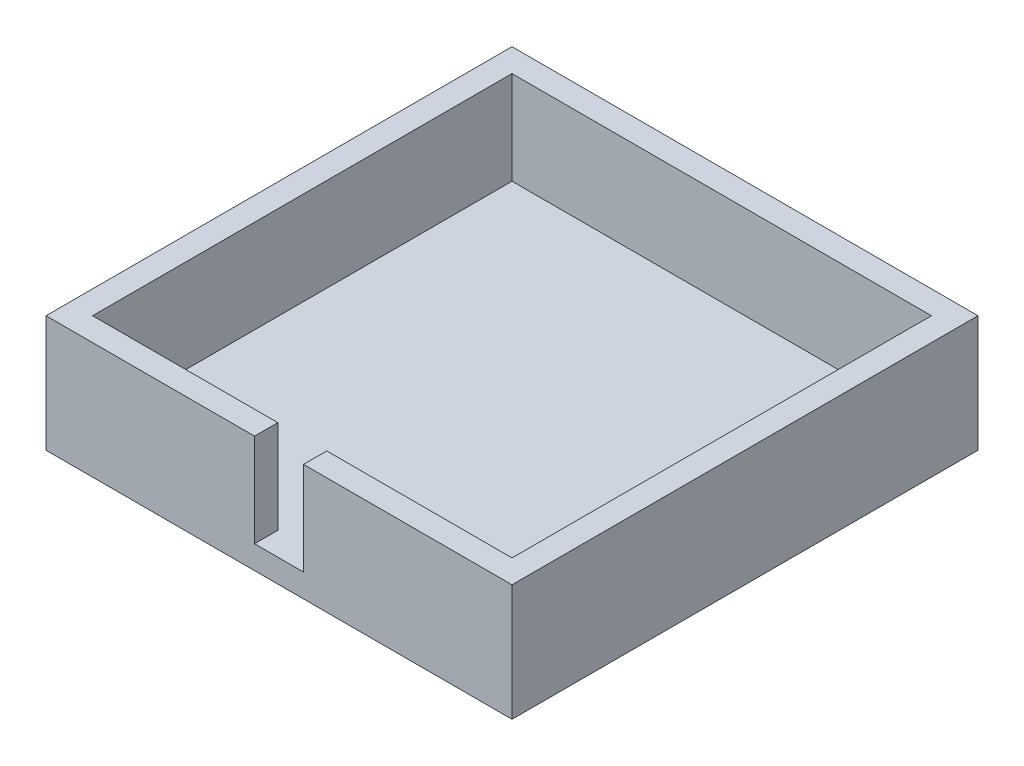
ISO-10303-21;
HEADER;
FILE_DESCRIPTION(('STEP AP214'),'2;1');
FILE_NAME('part.step','',(''),(''),'','','');
FILE_SCHEMA(('AUTOMOTIVE_DESIGN { 1 0 10303 214 1 1 1 1 }'));
ENDSEC;
DATA;
#1=APPLICATION_CONTEXT('core data for automotive mechanical design processes');
#2=APPLICATION_PROTOCOL_DEFINITION('international standard','automotive_design',2000,#1);
#3=PRODUCT_CONTEXT('',#1,'mechanical');
#4=PRODUCT('Part','Part','',(#3));
#5=PRODUCT_RELATED_PRODUCT_CATEGORY('part','',(#4));
#6=PRODUCT_DEFINITION_FORMATION('','',#4);
#7=PRODUCT_DEFINITION_CONTEXT('part definition',#1,'design');
#8=PRODUCT_DEFINITION('design','',#6,#7);
#9=PRODUCT_DEFINITION_SHAPE('','',#8);
#10=(LENGTH_UNIT() NAMED_UNIT(*) SI_UNIT(.MILLI.,.METRE.));
#11=(NAMED_UNIT(*) PLANE_ANGLE_UNIT() SI_UNIT($,.RADIAN.));
#12=(NAMED_UNIT(*) SI_UNIT($,.STERADIAN.) SOLID_ANGLE_UNIT());
#13=UNCERTAINTY_MEASURE_WITH_UNIT(LENGTH_MEASURE(1.E-05),#10,'distance_accuracy_value','');
#14=(GEOMETRIC_REPRESENTATION_CONTEXT(3) GLOBAL_UNCERTAINTY_ASSIGNED_CONTEXT((#13)) GLOBAL_UNIT_ASSIGNED_CONTEXT((#10,
#11,#12)) REPRESENTATION_CONTEXT('',''));
#15=CARTESIAN_POINT('',(0.,0.,0.));
#16=DIRECTION('',(0.,0.,1.));
#17=DIRECTION('',(1.,0.,0.));
#18=AXIS2_PLACEMENT_3D('',#15,#16,#17);
#19=CARTESIAN_POINT('',(-90.,50.000012,90.));
#20=DIRECTION('',(0.,0.,-1.));
#21=DIRECTION('',(-1.,0.,0.));
#22=AXIS2_PLACEMENT_3D('',#19,#20,#21);
#23=PLANE('',#22);
#24=DIRECTION('',(0.,1.,0.));
#25=VECTOR('',#24,1.);
#26=CARTESIAN_POINT('',(-10.5,50.000012,90.));
#27=LINE('',#26,#25);
#28=CARTESIAN_POINT('',(-10.5,10.,90.));
#29=VERTEX_POINT('',#28);
#30=CARTESIAN_POINT('',(-10.5,50.,90.));
#31=VERTEX_POINT('',#30);
#32=EDGE_CURVE('E156',#29,#31,#27,.T.);
#33=ORIENTED_EDGE('',*,*,#32,.F.);
#34=DIRECTION('',(1.,0.,0.));
#35=VECTOR('',#34,1.);
#36=CARTESIAN_POINT('',(-90.,10.,90.));
#37=LINE('',#36,#35);
#38=CARTESIAN_POINT('',(-90.,10.,90.));
#39=VERTEX_POINT('',#38);
#40=EDGE_CURVE('E130',#39,#29,#37,.T.);
#41=ORIENTED_EDGE('',*,*,#40,.F.);
#42=DIRECTION('',(0.,-1.,0.));
#43=VECTOR('',#42,1.);
#44=CARTESIAN_POINT('',(-90.,50.000012,90.));
#45=LINE('',#44,#43);
#46=CARTESIAN_POINT('',(-90.,50.,90.));
#47=VERTEX_POINT('',#46);
#48=EDGE_CURVE('E59',#47,#39,#45,.T.);
#49=ORIENTED_EDGE('',*,*,#48,.F.);
#50=DIRECTION('',(1.,0.,0.));
#51=VECTOR('',#50,1.);
#52=CARTESIAN_POINT('',(0.,50.,90.));
#53=LINE('',#52,#51);
#54=EDGE_CURVE('E208',#47,#31,#53,.T.);
#55=ORIENTED_EDGE('',*,*,#54,.T.);
#56=EDGE_LOOP('',(#33,#41,#49,#55));
#57=FACE_BOUND('',#56,.T.);
#58=ADVANCED_FACE('F36',(#57),#23,.T.);
#59=CARTESIAN_POINT('',(0.,50.,0.));
#60=DIRECTION('',(0.,-1.,0.));
#61=DIRECTION('',(0.,0.,-1.));
#62=AXIS2_PLACEMENT_3D('',#59,#60,#61);
#63=PLANE('',#62);
#64=DIRECTION('',(1.,0.,0.));
#65=VECTOR('',#64,1.);
#66=CARTESIAN_POINT('',(-100.,50.,100.));
#67=LINE('',#66,#65);
#68=CARTESIAN_POINT('',(-100.,50.,100.));
#69=VERTEX_POINT('',#68);
#70=CARTESIAN_POINT('',(-10.5,50.,100.));
#71=VERTEX_POINT('',#70);
#72=EDGE_CURVE('E186',#69,#71,#67,.T.);
#73=ORIENTED_EDGE('',*,*,#72,.T.);
#74=DIRECTION('',(0.,0.,1.));
#75=VECTOR('',#74,1.);
#76=CARTESIAN_POINT('',(-10.5,50.,60.));
#77=LINE('',#76,#75);
#78=EDGE_CURVE('E139',#31,#71,#77,.T.);
#79=ORIENTED_EDGE('',*,*,#78,.F.);
#80=ORIENTED_EDGE('',*,*,#54,.F.);
#81=DIRECTION('',(0.,0.,1.));
#82=VECTOR('',#81,1.);
#83=CARTESIAN_POINT('',(-90.,50.,0.));
#84=LINE('',#83,#82);
#85=CARTESIAN_POINT('',(-90.,50.,-90.));
#86=VERTEX_POINT('',#85);
#87=EDGE_CURVE('E210',#86,#47,#84,.T.);
#88=ORIENTED_EDGE('',*,*,#87,.F.);
#89=DIRECTION('',(-1.,0.,0.));
#90=VECTOR('',#89,1.);
#91=CARTESIAN_POINT('',(0.,50.,-90.));
#92=LINE('',#91,#90);
#93=CARTESIAN_POINT('',(90.,50.,-90.));
#94=VERTEX_POINT('',#93);
#95=EDGE_CURVE('E44',#94,#86,#92,.T.);
#96=ORIENTED_EDGE('',*,*,#95,.F.);
#97=DIRECTION('',(0.,0.,-1.));
#98=VECTOR('',#97,1.);
#99=CARTESIAN_POINT('',(90.,50.,0.));
#100=LINE('',#99,#98);
#101=CARTESIAN_POINT('',(90.,50.,90.));
#102=VERTEX_POINT('',#101);
#103=EDGE_CURVE('E11',#102,#94,#100,.T.);
#104=ORIENTED_EDGE('',*,*,#103,.F.);
#105=CARTESIAN_POINT('',(10.5,50.,90.));
#106=VERTEX_POINT('',#105);
#107=EDGE_CURVE('E207',#106,#102,#53,.T.);
#108=ORIENTED_EDGE('',*,*,#107,.F.);
#109=DIRECTION('',(0.,0.,1.));
#110=VECTOR('',#109,1.);
#111=CARTESIAN_POINT('',(10.5,50.,60.));
#112=LINE('',#111,#110);
#113=CARTESIAN_POINT('',(10.5,50.,100.));
#114=VERTEX_POINT('',#113);
#115=EDGE_CURVE('E151',#106,#114,#112,.T.);
#116=ORIENTED_EDGE('',*,*,#115,.T.);
#117=CARTESIAN_POINT('',(100.,50.,100.));
#118=VERTEX_POINT('',#117);
#119=EDGE_CURVE('E185',#114,#118,#67,.T.);
#120=ORIENTED_EDGE('',*,*,#119,.T.);
#121=DIRECTION('',(0.,0.,-1.));
#122=VECTOR('',#121,1.);
#123=CARTESIAN_POINT('',(100.,50.,100.));
#124=LINE('',#123,#122);
#125=CARTESIAN_POINT('',(100.,50.,-100.));
#126=VERTEX_POINT('',#125);
#127=EDGE_CURVE('E177',#118,#126,#124,.T.);
#128=ORIENTED_EDGE('',*,*,#127,.T.);
#129=DIRECTION('',(-1.,0.,0.));
#130=VECTOR('',#129,1.);
#131=CARTESIAN_POINT('',(-100.,50.,-100.));
#132=LINE('',#131,#130);
#133=CARTESIAN_POINT('',(-100.,50.,-100.));
#134=VERTEX_POINT('',#133);
#135=EDGE_CURVE('E180',#126,#134,#132,.T.);
#136=ORIENTED_EDGE('',*,*,#135,.T.);
#137=DIRECTION('',(0.,0.,1.));
#138=VECTOR('',#137,1.);
#139=CARTESIAN_POINT('',(-100.,50.,100.));
#140=LINE('',#139,#138);
#141=EDGE_CURVE('E183',#134,#69,#140,.T.);
#142=ORIENTED_EDGE('',*,*,#141,.T.);
#143=EDGE_LOOP('',(#73,#79,#80,#88,#96,#104,#108,#116,#120,#128,#136,#142));
#144=FACE_BOUND('',#143,.T.);
#145=ADVANCED_FACE('F224',(#144),#63,.F.);
#146=CARTESIAN_POINT('',(100.,50.,100.));
#147=DIRECTION('',(-1.,0.,0.));
#148=DIRECTION('',(0.,0.,1.));
#149=AXIS2_PLACEMENT_3D('',#146,#147,#148);
#150=PLANE('',#149);
#151=DIRECTION('',(0.,0.,-1.));
#152=VECTOR('',#151,1.);
#153=CARTESIAN_POINT('',(100.,0.,100.));
#154=LINE('',#153,#152);
#155=CARTESIAN_POINT('',(100.,0.,100.));
#156=VERTEX_POINT('',#155);
#157=CARTESIAN_POINT('',(100.,0.,-100.));
#158=VERTEX_POINT('',#157);
#159=EDGE_CURVE('E176',#156,#158,#154,.T.);
#160=ORIENTED_EDGE('',*,*,#159,.T.);
#161=DIRECTION('',(0.,-1.,0.));
#162=VECTOR('',#161,1.);
#163=CARTESIAN_POINT('',(100.,50.,-100.));
#164=LINE('',#163,#162);
#165=EDGE_CURVE('E204',#126,#158,#164,.T.);
#166=ORIENTED_EDGE('',*,*,#165,.F.);
#167=ORIENTED_EDGE('',*,*,#127,.F.);
#168=DIRECTION('',(0.,-1.,0.));
#169=VECTOR('',#168,1.);
#170=CARTESIAN_POINT('',(100.,50.,100.));
#171=LINE('',#170,#169);
#172=EDGE_CURVE('E188',#118,#156,#171,.T.);
#173=ORIENTED_EDGE('',*,*,#172,.T.);
#174=EDGE_LOOP('',(#160,#166,#167,#173));
#175=FACE_BOUND('',#174,.T.);
#176=ADVANCED_FACE('F38',(#175),#150,.F.);
#177=CARTESIAN_POINT('',(-100.,50.,-100.));
#178=DIRECTION('',(0.,0.,1.));
#179=DIRECTION('',(1.,0.,0.));
#180=AXIS2_PLACEMENT_3D('',#177,#178,#179);
#181=PLANE('',#180);
#182=DIRECTION('',(-1.,0.,0.));
#183=VECTOR('',#182,1.);
#184=CARTESIAN_POINT('',(-100.,0.,-100.));
#185=LINE('',#184,#183);
#186=CARTESIAN_POINT('',(-100.,0.,-100.));
#187=VERTEX_POINT('',#186);
#188=EDGE_CURVE('E191',#158,#187,#185,.T.);
#189=ORIENTED_EDGE('',*,*,#188,.T.);
#190=DIRECTION('',(0.,-1.,0.));
#191=VECTOR('',#190,1.);
#192=CARTESIAN_POINT('',(-100.,50.,-100.));
#193=LINE('',#192,#191);
#194=EDGE_CURVE('E201',#134,#187,#193,.T.);
#195=ORIENTED_EDGE('',*,*,#194,.F.);
#196=ORIENTED_EDGE('',*,*,#135,.F.);
#197=ORIENTED_EDGE('',*,*,#165,.T.);
#198=EDGE_LOOP('',(#189,#195,#196,#197));
#199=FACE_BOUND('',#198,.T.);
#200=ADVANCED_FACE('F263',(#199),#181,.F.);
#201=CARTESIAN_POINT('',(-100.,50.,100.));
#202=DIRECTION('',(1.,0.,0.));
#203=DIRECTION('',(0.,0.,-1.));
#204=AXIS2_PLACEMENT_3D('',#201,#202,#203);
#205=PLANE('',#204);
#206=DIRECTION('',(0.,0.,1.));
#207=VECTOR('',#206,1.);
#208=CARTESIAN_POINT('',(-100.,0.,100.));
#209=LINE('',#208,#207);
#210=CARTESIAN_POINT('',(-100.,0.,100.));
#211=VERTEX_POINT('',#210);
#212=EDGE_CURVE('E193',#187,#211,#209,.T.);
#213=ORIENTED_EDGE('',*,*,#212,.T.);
#214=DIRECTION('',(0.,-1.,0.));
#215=VECTOR('',#214,1.);
#216=CARTESIAN_POINT('',(-100.,50.,100.));
#217=LINE('',#216,#215);
#218=EDGE_CURVE('E198',#69,#211,#217,.T.);
#219=ORIENTED_EDGE('',*,*,#218,.F.);
#220=ORIENTED_EDGE('',*,*,#141,.F.);
#221=ORIENTED_EDGE('',*,*,#194,.T.);
#222=EDGE_LOOP('',(#213,#219,#220,#221));
#223=FACE_BOUND('',#222,.T.);
#224=ADVANCED_FACE('F261',(#223),#205,.F.);
#225=CARTESIAN_POINT('',(-100.,50.,100.));
#226=DIRECTION('',(0.,0.,-1.));
#227=DIRECTION('',(-1.,0.,0.));
#228=AXIS2_PLACEMENT_3D('',#225,#226,#227);
#229=PLANE('',#228);
#230=DIRECTION('',(1.,0.,0.));
#231=VECTOR('',#230,1.);
#232=CARTESIAN_POINT('',(-10.5,10.,100.));
#233=LINE('',#232,#231);
#234=CARTESIAN_POINT('',(-10.5,10.,100.));
#235=VERTEX_POINT('',#234);
#236=CARTESIAN_POINT('',(10.5,10.,100.));
#237=VERTEX_POINT('',#236);
#238=EDGE_CURVE('E127',#235,#237,#233,.T.);
#239=ORIENTED_EDGE('',*,*,#238,.F.);
#240=DIRECTION('',(0.,-1.,0.));
#241=VECTOR('',#240,1.);
#242=CARTESIAN_POINT('',(-10.5,10.,100.));
#243=LINE('',#242,#241);
#244=EDGE_CURVE('E136',#71,#235,#243,.T.);
#245=ORIENTED_EDGE('',*,*,#244,.F.);
#246=ORIENTED_EDGE('',*,*,#72,.F.);
#247=ORIENTED_EDGE('',*,*,#218,.T.);
#248=DIRECTION('',(1.,0.,0.));
#249=VECTOR('',#248,1.);
#250=CARTESIAN_POINT('',(-100.,0.,100.));
#251=LINE('',#250,#249);
#252=EDGE_CURVE('E181',#211,#156,#251,.T.);
#253=ORIENTED_EDGE('',*,*,#252,.T.);
#254=ORIENTED_EDGE('',*,*,#172,.F.);
#255=ORIENTED_EDGE('',*,*,#119,.F.);
#256=DIRECTION('',(0.,1.,0.));
#257=VECTOR('',#256,1.);
#258=CARTESIAN_POINT('',(10.5,10.,100.));
#259=LINE('',#258,#257);
#260=EDGE_CURVE('E133',#237,#114,#259,.T.);
#261=ORIENTED_EDGE('',*,*,#260,.F.);
#262=EDGE_LOOP('',(#239,#245,#246,#247,#253,#254,#255,#261));
#263=FACE_BOUND('',#262,.T.);
#264=ADVANCED_FACE('F144',(#263),#229,.F.);
#265=CARTESIAN_POINT('',(0.,0.,0.));
#266=DIRECTION('',(0.,-1.,0.));
#267=DIRECTION('',(0.,0.,-1.));
#268=AXIS2_PLACEMENT_3D('',#265,#266,#267);
#269=PLANE('',#268);
#270=ORIENTED_EDGE('',*,*,#159,.F.);
#271=ORIENTED_EDGE('',*,*,#252,.F.);
#272=ORIENTED_EDGE('',*,*,#212,.F.);
#273=ORIENTED_EDGE('',*,*,#188,.F.);
#274=EDGE_LOOP('',(#270,#271,#272,#273));
#275=FACE_BOUND('',#274,.T.);
#276=ADVANCED_FACE('F249',(#275),#269,.T.);
#277=CARTESIAN_POINT('',(90.,50.000012,90.));
#278=DIRECTION('',(-1.,0.,0.));
#279=DIRECTION('',(0.,0.,1.));
#280=AXIS2_PLACEMENT_3D('',#277,#278,#279);
#281=PLANE('',#280);
#282=ORIENTED_EDGE('',*,*,#103,.T.);
#283=DIRECTION('',(0.,-1.,0.));
#284=VECTOR('',#283,1.);
#285=CARTESIAN_POINT('',(90.,50.000012,-90.));
#286=LINE('',#285,#284);
#287=CARTESIAN_POINT('',(90.,10.,-90.));
#288=VERTEX_POINT('',#287);
#289=EDGE_CURVE('E174',#94,#288,#286,.T.);
#290=ORIENTED_EDGE('',*,*,#289,.T.);
#291=DIRECTION('',(0.,0.,-1.));
#292=VECTOR('',#291,1.);
#293=CARTESIAN_POINT('',(90.,10.,90.));
#294=LINE('',#293,#292);
#295=CARTESIAN_POINT('',(90.,10.,90.));
#296=VERTEX_POINT('',#295);
#297=EDGE_CURVE('E158',#296,#288,#294,.T.);
#298=ORIENTED_EDGE('',*,*,#297,.F.);
#299=DIRECTION('',(0.,-1.,0.));
#300=VECTOR('',#299,1.);
#301=CARTESIAN_POINT('',(90.,50.000012,90.));
#302=LINE('',#301,#300);
#303=EDGE_CURVE('E168',#102,#296,#302,.T.);
#304=ORIENTED_EDGE('',*,*,#303,.F.);
#305=EDGE_LOOP('',(#282,#290,#298,#304));
#306=FACE_BOUND('',#305,.T.);
#307=ADVANCED_FACE('F246',(#306),#281,.T.);
#308=CARTESIAN_POINT('',(-90.,50.000012,-90.));
#309=DIRECTION('',(0.,0.,1.));
#310=DIRECTION('',(1.,0.,0.));
#311=AXIS2_PLACEMENT_3D('',#308,#309,#310);
#312=PLANE('',#311);
#313=ORIENTED_EDGE('',*,*,#95,.T.);
#314=DIRECTION('',(0.,-1.,0.));
#315=VECTOR('',#314,1.);
#316=CARTESIAN_POINT('',(-90.,50.000012,-90.));
#317=LINE('',#316,#315);
#318=CARTESIAN_POINT('',(-90.,10.,-90.));
#319=VERTEX_POINT('',#318);
#320=EDGE_CURVE('E172',#86,#319,#317,.T.);
#321=ORIENTED_EDGE('',*,*,#320,.T.);
#322=DIRECTION('',(-1.,0.,0.));
#323=VECTOR('',#322,1.);
#324=CARTESIAN_POINT('',(-90.,10.,-90.));
#325=LINE('',#324,#323);
#326=EDGE_CURVE('E161',#288,#319,#325,.T.);
#327=ORIENTED_EDGE('',*,*,#326,.F.);
#328=ORIENTED_EDGE('',*,*,#289,.F.);
#329=EDGE_LOOP('',(#313,#321,#327,#328));
#330=FACE_BOUND('',#329,.T.);
#331=ADVANCED_FACE('F215',(#330),#312,.T.);
#332=CARTESIAN_POINT('',(-90.,50.000012,90.));
#333=DIRECTION('',(1.,0.,0.));
#334=DIRECTION('',(0.,0.,-1.));
#335=AXIS2_PLACEMENT_3D('',#332,#333,#334);
#336=PLANE('',#335);
#337=ORIENTED_EDGE('',*,*,#87,.T.);
#338=ORIENTED_EDGE('',*,*,#48,.T.);
#339=DIRECTION('',(0.,0.,1.));
#340=VECTOR('',#339,1.);
#341=CARTESIAN_POINT('',(-90.,10.,90.));
#342=LINE('',#341,#340);
#343=EDGE_CURVE('E164',#319,#39,#342,.T.);
#344=ORIENTED_EDGE('',*,*,#343,.F.);
#345=ORIENTED_EDGE('',*,*,#320,.F.);
#346=EDGE_LOOP('',(#337,#338,#344,#345));
#347=FACE_BOUND('',#346,.T.);
#348=ADVANCED_FACE('F222',(#347),#336,.T.);
#349=DIRECTION('',(0.,-1.,0.));
#350=VECTOR('',#349,1.);
#351=CARTESIAN_POINT('',(10.5,50.000012,90.));
#352=LINE('',#351,#350);
#353=CARTESIAN_POINT('',(10.5,10.,90.));
#354=VERTEX_POINT('',#353);
#355=EDGE_CURVE('E150',#106,#354,#352,.T.);
#356=ORIENTED_EDGE('',*,*,#355,.F.);
#357=ORIENTED_EDGE('',*,*,#107,.T.);
#358=ORIENTED_EDGE('',*,*,#303,.T.);
#359=EDGE_CURVE('E166',#354,#296,#37,.T.);
#360=ORIENTED_EDGE('',*,*,#359,.F.);
#361=EDGE_LOOP('',(#356,#357,#358,#360));
#362=FACE_BOUND('',#361,.T.);
#363=ADVANCED_FACE('F227',(#362),#23,.T.);
#364=CARTESIAN_POINT('',(0.,10.,0.));
#365=DIRECTION('',(0.,-1.,0.));
#366=DIRECTION('',(0.,0.,-1.));
#367=AXIS2_PLACEMENT_3D('',#364,#365,#366);
#368=PLANE('',#367);
#369=ORIENTED_EDGE('',*,*,#40,.T.);
#370=DIRECTION('',(0.,0.,1.));
#371=VECTOR('',#370,1.);
#372=CARTESIAN_POINT('',(-10.5,10.,60.));
#373=LINE('',#372,#371);
#374=EDGE_CURVE('E123',#29,#235,#373,.T.);
#375=ORIENTED_EDGE('',*,*,#374,.T.);
#376=ORIENTED_EDGE('',*,*,#238,.T.);
#377=DIRECTION('',(0.,0.,1.));
#378=VECTOR('',#377,1.);
#379=CARTESIAN_POINT('',(10.5,10.,60.));
#380=LINE('',#379,#378);
#381=EDGE_CURVE('E51',#354,#237,#380,.T.);
#382=ORIENTED_EDGE('',*,*,#381,.F.);
#383=ORIENTED_EDGE('',*,*,#359,.T.);
#384=ORIENTED_EDGE('',*,*,#297,.T.);
#385=ORIENTED_EDGE('',*,*,#326,.T.);
#386=ORIENTED_EDGE('',*,*,#343,.T.);
#387=EDGE_LOOP('',(#369,#375,#376,#382,#383,#384,#385,#386));
#388=FACE_BOUND('',#387,.T.);
#389=ADVANCED_FACE('F125',(#388),#368,.F.);
#390=CARTESIAN_POINT('',(-10.5,10.,60.));
#391=DIRECTION('',(-1.,0.,0.));
#392=DIRECTION('',(0.,-1.,0.));
#393=AXIS2_PLACEMENT_3D('',#390,#391,#392);
#394=PLANE('',#393);
#395=ORIENTED_EDGE('',*,*,#32,.T.);
#396=ORIENTED_EDGE('',*,*,#78,.T.);
#397=ORIENTED_EDGE('',*,*,#244,.T.);
#398=ORIENTED_EDGE('',*,*,#374,.F.);
#399=EDGE_LOOP('',(#395,#396,#397,#398));
#400=FACE_BOUND('',#399,.T.);
#401=ADVANCED_FACE('F137',(#400),#394,.F.);
#402=CARTESIAN_POINT('',(10.5,10.,60.));
#403=DIRECTION('',(1.,0.,0.));
#404=DIRECTION('',(0.,1.,0.));
#405=AXIS2_PLACEMENT_3D('',#402,#403,#404);
#406=PLANE('',#405);
#407=ORIENTED_EDGE('',*,*,#355,.T.);
#408=ORIENTED_EDGE('',*,*,#381,.T.);
#409=ORIENTED_EDGE('',*,*,#260,.T.);
#410=ORIENTED_EDGE('',*,*,#115,.F.);
#411=EDGE_LOOP('',(#407,#408,#409,#410));
#412=FACE_BOUND('',#411,.T.);
#413=ADVANCED_FACE('F323',(#412),#406,.F.);
#414=CLOSED_SHELL('',(#58,#145,#176,#200,#224,#264,#276,#307,#331,#348,#363,#389,#401,#413));
#415=MANIFOLD_SOLID_BREP('B2',#414);
#416=ADVANCED_BREP_SHAPE_REPRESENTATION('',(#18,#415),#14);
#417=SHAPE_DEFINITION_REPRESENTATION(#9,#416);
ENDSEC;
END-ISO-10303-21;
